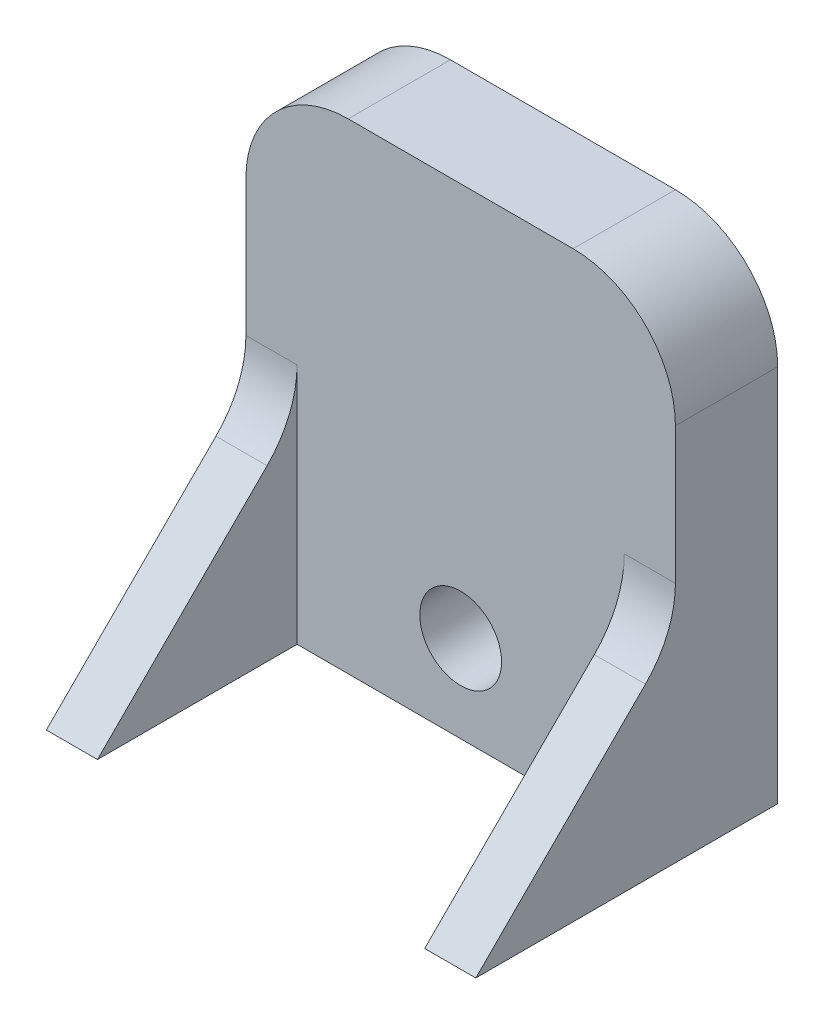
ISO-10303-21;
HEADER;
FILE_DESCRIPTION(('STEP AP214'),'2;1');
FILE_NAME('part.step','',(''),(''),'','','');
FILE_SCHEMA(('AUTOMOTIVE_DESIGN { 1 0 10303 214 1 1 1 1 }'));
ENDSEC;
DATA;
#1=APPLICATION_CONTEXT('core data for automotive mechanical design processes');
#2=APPLICATION_PROTOCOL_DEFINITION('international standard','automotive_design',2000,#1);
#3=PRODUCT_CONTEXT('',#1,'mechanical');
#4=PRODUCT('Part','Part','',(#3));
#5=PRODUCT_RELATED_PRODUCT_CATEGORY('part','',(#4));
#6=PRODUCT_DEFINITION_FORMATION('','',#4);
#7=PRODUCT_DEFINITION_CONTEXT('part definition',#1,'design');
#8=PRODUCT_DEFINITION('design','',#6,#7);
#9=PRODUCT_DEFINITION_SHAPE('','',#8);
#10=(LENGTH_UNIT() NAMED_UNIT(*) SI_UNIT(.MILLI.,.METRE.));
#11=(NAMED_UNIT(*) PLANE_ANGLE_UNIT() SI_UNIT($,.RADIAN.));
#12=(NAMED_UNIT(*) SI_UNIT($,.STERADIAN.) SOLID_ANGLE_UNIT());
#13=UNCERTAINTY_MEASURE_WITH_UNIT(LENGTH_MEASURE(1.E-05),#10,'distance_accuracy_value','');
#14=(GEOMETRIC_REPRESENTATION_CONTEXT(3) GLOBAL_UNCERTAINTY_ASSIGNED_CONTEXT((#13)) GLOBAL_UNIT_ASSIGNED_CONTEXT((#10,
#11,#12)) REPRESENTATION_CONTEXT('',''));
#15=CARTESIAN_POINT('',(0.,0.,0.));
#16=DIRECTION('',(0.,0.,1.));
#17=DIRECTION('',(1.,0.,0.));
#18=AXIS2_PLACEMENT_3D('',#15,#16,#17);
#19=CARTESIAN_POINT('',(-7.44489648097013,17.4806525942305,0.));
#20=DIRECTION('',(0.,0.,1.));
#21=DIRECTION('',(1.,0.,0.));
#22=AXIS2_PLACEMENT_3D('',#19,#20,#21);
#23=PLANE('',#22);
#24=CARTESIAN_POINT('',(-18.4448964809706,-11.0193474057693,0.));
#25=DIRECTION('',(0.,0.,1.));
#26=DIRECTION('',(1.,0.,0.));
#27=AXIS2_PLACEMENT_3D('',#24,#25,#26);
#28=CIRCLE('',#27,4.);
#29=CARTESIAN_POINT('',(-14.4448964809706,-11.0193474057693,0.));
#30=VERTEX_POINT('',#29);
#31=EDGE_CURVE('E159',#30,#30,#28,.T.);
#32=ORIENTED_EDGE('',*,*,#31,.F.);
#33=EDGE_LOOP('',(#32));
#34=FACE_BOUND('',#33,.T.);
#35=DIRECTION('',(0.,-1.,0.));
#36=VECTOR('',#35,1.);
#37=CARTESIAN_POINT('',(-2.44489648097043,0.,0.));
#38=LINE('',#37,#36);
#39=CARTESIAN_POINT('',(-2.44489648097036,4.14213562373103,0.));
#40=VERTEX_POINT('',#39);
#41=CARTESIAN_POINT('',(-2.44489648097061,-19.5193474057696,0.));
#42=VERTEX_POINT('',#41);
#43=EDGE_CURVE('E128',#40,#42,#38,.T.);
#44=ORIENTED_EDGE('',*,*,#43,.F.);
#45=DIRECTION('',(1.,0.,0.));
#46=VECTOR('',#45,1.);
#47=CARTESIAN_POINT('',(-7.44489648097036,4.14213562373112,0.));
#48=LINE('',#47,#46);
#49=CARTESIAN_POINT('',(2.55510351902964,4.14213562373095,0.));
#50=VERTEX_POINT('',#49);
#51=EDGE_CURVE('E220',#40,#50,#48,.T.);
#52=ORIENTED_EDGE('',*,*,#51,.T.);
#53=DIRECTION('',(0.,1.,0.));
#54=VECTOR('',#53,1.);
#55=CARTESIAN_POINT('',(2.55510351902923,-19.5193474057697,0.));
#56=LINE('',#55,#54);
#57=CARTESIAN_POINT('',(2.55510351902987,17.4806525942303,0.));
#58=VERTEX_POINT('',#57);
#59=EDGE_CURVE('E185',#50,#58,#56,.T.);
#60=ORIENTED_EDGE('',*,*,#59,.T.);
#61=CARTESIAN_POINT('',(-7.44489648097013,17.4806525942305,0.));
#62=DIRECTION('',(0.,0.,1.));
#63=DIRECTION('',(1.,0.,0.));
#64=AXIS2_PLACEMENT_3D('',#61,#62,#63);
#65=CIRCLE('',#64,10.);
#66=CARTESIAN_POINT('',(-7.44489648096995,27.4806525942305,0.));
#67=VERTEX_POINT('',#66);
#68=EDGE_CURVE('E187',#58,#67,#65,.T.);
#69=ORIENTED_EDGE('',*,*,#68,.T.);
#70=DIRECTION('',(-1.,0.,0.));
#71=VECTOR('',#70,1.);
#72=CARTESIAN_POINT('',(-7.44489648096995,27.4806525942305,0.));
#73=LINE('',#72,#71);
#74=CARTESIAN_POINT('',(-29.44489648097,27.4806525942309,0.));
#75=VERTEX_POINT('',#74);
#76=EDGE_CURVE('E190',#67,#75,#73,.T.);
#77=ORIENTED_EDGE('',*,*,#76,.T.);
#78=CARTESIAN_POINT('',(-29.4448964809701,17.4806525942309,0.));
#79=DIRECTION('',(0.,0.,1.));
#80=DIRECTION('',(-1.,0.,0.));
#81=AXIS2_PLACEMENT_3D('',#78,#79,#80);
#82=CIRCLE('',#81,10.);
#83=CARTESIAN_POINT('',(-39.4448964809701,17.480652594231,0.));
#84=VERTEX_POINT('',#83);
#85=EDGE_CURVE('E193',#75,#84,#82,.T.);
#86=ORIENTED_EDGE('',*,*,#85,.T.);
#87=DIRECTION('',(0.,-1.,0.));
#88=VECTOR('',#87,1.);
#89=CARTESIAN_POINT('',(-39.4448964809701,17.480652594231,0.));
#90=LINE('',#89,#88);
#91=CARTESIAN_POINT('',(-39.4448964809704,4.14213562373168,0.));
#92=VERTEX_POINT('',#91);
#93=EDGE_CURVE('E169',#84,#92,#90,.T.);
#94=ORIENTED_EDGE('',*,*,#93,.T.);
#95=DIRECTION('',(-1.,0.,0.));
#96=VECTOR('',#95,1.);
#97=CARTESIAN_POINT('',(-34.4448964809704,4.14213562373159,0.));
#98=LINE('',#97,#96);
#99=CARTESIAN_POINT('',(-34.4448964809704,4.14213562373159,0.));
#100=VERTEX_POINT('',#99);
#101=EDGE_CURVE('E213',#92,#100,#98,.F.);
#102=ORIENTED_EDGE('',*,*,#101,.T.);
#103=DIRECTION('',(0.,-1.,0.));
#104=VECTOR('',#103,1.);
#105=CARTESIAN_POINT('',(-34.4448964809704,6.00853317480465E-13,0.));
#106=LINE('',#105,#104);
#107=CARTESIAN_POINT('',(-34.4448964809706,-19.5193474057691,0.));
#108=VERTEX_POINT('',#107);
#109=EDGE_CURVE('E145',#100,#108,#106,.T.);
#110=ORIENTED_EDGE('',*,*,#109,.T.);
#111=DIRECTION('',(1.,0.,0.));
#112=VECTOR('',#111,1.);
#113=CARTESIAN_POINT('',(-39.4448964809708,-19.519347405769,0.));
#114=LINE('',#113,#112);
#115=EDGE_CURVE('E163',#108,#42,#114,.T.);
#116=ORIENTED_EDGE('',*,*,#115,.T.);
#117=EDGE_LOOP('',(#44,#52,#60,#69,#77,#86,#94,#102,#110,#116));
#118=FACE_BOUND('',#117,.T.);
#119=ADVANCED_FACE('F33',(#34,#118),#23,.T.);
#120=CARTESIAN_POINT('',(-39.4448964809708,-19.519347405769,-10.));
#121=DIRECTION('',(0.,-1.,0.));
#122=DIRECTION('',(1.,0.,0.));
#123=AXIS2_PLACEMENT_3D('',#120,#121,#122);
#124=PLANE('',#123);
#125=ORIENTED_EDGE('',*,*,#115,.F.);
#126=DIRECTION('',(0.,0.,1.));
#127=VECTOR('',#126,1.);
#128=CARTESIAN_POINT('',(-34.4448964809708,-19.5193474057691,0.));
#129=LINE('',#128,#127);
#130=CARTESIAN_POINT('',(-34.4448964809708,-19.5193474057691,19.5193474057699));
#131=VERTEX_POINT('',#130);
#132=EDGE_CURVE('E148',#108,#131,#129,.T.);
#133=ORIENTED_EDGE('',*,*,#132,.T.);
#134=DIRECTION('',(-1.,0.,0.));
#135=VECTOR('',#134,1.);
#136=CARTESIAN_POINT('',(-34.4448964809708,-19.5193474057691,19.5193474057699));
#137=LINE('',#136,#135);
#138=CARTESIAN_POINT('',(-39.4448964809708,-19.519347405769,19.5193474057699));
#139=VERTEX_POINT('',#138);
#140=EDGE_CURVE('E154',#131,#139,#137,.T.);
#141=ORIENTED_EDGE('',*,*,#140,.T.);
#142=DIRECTION('',(0.,0.,1.));
#143=VECTOR('',#142,1.);
#144=CARTESIAN_POINT('',(-39.4448964809708,-19.519347405769,-10.));
#145=LINE('',#144,#143);
#146=CARTESIAN_POINT('',(-39.4448964809708,-19.519347405769,-10.));
#147=VERTEX_POINT('',#146);
#148=EDGE_CURVE('E198',#147,#139,#145,.T.);
#149=ORIENTED_EDGE('',*,*,#148,.F.);
#150=DIRECTION('',(1.,0.,0.));
#151=VECTOR('',#150,1.);
#152=CARTESIAN_POINT('',(-39.4448964809708,-19.519347405769,-10.));
#153=LINE('',#152,#151);
#154=CARTESIAN_POINT('',(2.55510351902923,-19.5193474057697,-10.));
#155=VERTEX_POINT('',#154);
#156=EDGE_CURVE('E166',#147,#155,#153,.T.);
#157=ORIENTED_EDGE('',*,*,#156,.T.);
#158=DIRECTION('',(0.,0.,1.));
#159=VECTOR('',#158,1.);
#160=CARTESIAN_POINT('',(2.55510351902923,-19.5193474057697,-10.));
#161=LINE('',#160,#159);
#162=CARTESIAN_POINT('',(2.55510351902923,-19.5193474057697,19.5193474057699));
#163=VERTEX_POINT('',#162);
#164=EDGE_CURVE('E136',#155,#163,#161,.T.);
#165=ORIENTED_EDGE('',*,*,#164,.T.);
#166=DIRECTION('',(1.,0.,0.));
#167=VECTOR('',#166,1.);
#168=CARTESIAN_POINT('',(-2.44489648097077,-19.5193474057696,19.5193474057699));
#169=LINE('',#168,#167);
#170=CARTESIAN_POINT('',(-2.44489648097077,-19.5193474057696,19.5193474057699));
#171=VERTEX_POINT('',#170);
#172=EDGE_CURVE('E131',#171,#163,#169,.T.);
#173=ORIENTED_EDGE('',*,*,#172,.F.);
#174=DIRECTION('',(0.,0.,1.));
#175=VECTOR('',#174,1.);
#176=CARTESIAN_POINT('',(-2.44489648097077,-19.5193474057696,0.));
#177=LINE('',#176,#175);
#178=EDGE_CURVE('E123',#42,#171,#177,.T.);
#179=ORIENTED_EDGE('',*,*,#178,.F.);
#180=EDGE_LOOP('',(#125,#133,#141,#149,#157,#165,#173,#179));
#181=FACE_BOUND('',#180,.T.);
#182=ADVANCED_FACE('F134',(#181),#124,.T.);
#183=CARTESIAN_POINT('',(-39.4448964809701,17.480652594231,-10.));
#184=DIRECTION('',(-1.,0.,0.));
#185=DIRECTION('',(0.,-1.,0.));
#186=AXIS2_PLACEMENT_3D('',#183,#184,#185);
#187=PLANE('',#186);
#188=ORIENTED_EDGE('',*,*,#93,.F.);
#189=DIRECTION('',(0.,0.,1.));
#190=VECTOR('',#189,1.);
#191=CARTESIAN_POINT('',(-39.4448964809701,17.480652594231,-10.));
#192=LINE('',#191,#190);
#193=CARTESIAN_POINT('',(-39.4448964809701,17.480652594231,-10.));
#194=VERTEX_POINT('',#193);
#195=EDGE_CURVE('E201',#194,#84,#192,.T.);
#196=ORIENTED_EDGE('',*,*,#195,.F.);
#197=DIRECTION('',(0.,-1.,0.));
#198=VECTOR('',#197,1.);
#199=CARTESIAN_POINT('',(-39.4448964809701,17.480652594231,-10.));
#200=LINE('',#199,#198);
#201=EDGE_CURVE('E181',#194,#147,#200,.T.);
#202=ORIENTED_EDGE('',*,*,#201,.T.);
#203=ORIENTED_EDGE('',*,*,#148,.T.);
#204=DIRECTION('',(0.,0.707106781186544,-0.707106781186552));
#205=VECTOR('',#204,1.);
#206=CARTESIAN_POINT('',(-39.4448964809708,-19.519347405769,19.5193474057699));
#207=LINE('',#206,#205);
#208=CARTESIAN_POINT('',(-39.4448964809705,-2.92893218813384,2.92893218813456));
#209=VERTEX_POINT('',#208);
#210=EDGE_CURVE('E137',#139,#209,#207,.T.);
#211=ORIENTED_EDGE('',*,*,#210,.T.);
#212=CARTESIAN_POINT('',(-39.4448964809704,4.14213562373168,10.));
#213=DIRECTION('',(-1.,0.,0.));
#214=DIRECTION('',(0.,-1.,0.));
#215=AXIS2_PLACEMENT_3D('',#212,#213,#214);
#216=CIRCLE('',#215,10.);
#217=EDGE_CURVE('E216',#209,#92,#216,.F.);
#218=ORIENTED_EDGE('',*,*,#217,.T.);
#219=EDGE_LOOP('',(#188,#196,#202,#203,#211,#218));
#220=FACE_BOUND('',#219,.T.);
#221=ADVANCED_FACE('F243',(#220),#187,.T.);
#222=CARTESIAN_POINT('',(-29.4448964809701,17.4806525942309,-10.));
#223=DIRECTION('',(0.,0.,1.));
#224=DIRECTION('',(1.,0.,0.));
#225=AXIS2_PLACEMENT_3D('',#222,#223,#224);
#226=CYLINDRICAL_SURFACE('',#225,10.);
#227=ORIENTED_EDGE('',*,*,#85,.F.);
#228=DIRECTION('',(0.,0.,1.));
#229=VECTOR('',#228,1.);
#230=CARTESIAN_POINT('',(-29.44489648097,27.4806525942309,-10.));
#231=LINE('',#230,#229);
#232=CARTESIAN_POINT('',(-29.44489648097,27.4806525942309,-10.));
#233=VERTEX_POINT('',#232);
#234=EDGE_CURVE('E203',#233,#75,#231,.T.);
#235=ORIENTED_EDGE('',*,*,#234,.F.);
#236=CARTESIAN_POINT('',(-29.4448964809701,17.4806525942309,-10.));
#237=DIRECTION('',(0.,0.,1.));
#238=DIRECTION('',(-1.,0.,0.));
#239=AXIS2_PLACEMENT_3D('',#236,#237,#238);
#240=CIRCLE('',#239,10.);
#241=EDGE_CURVE('E178',#233,#194,#240,.T.);
#242=ORIENTED_EDGE('',*,*,#241,.T.);
#243=ORIENTED_EDGE('',*,*,#195,.T.);
#244=EDGE_LOOP('',(#227,#235,#242,#243));
#245=FACE_BOUND('',#244,.T.);
#246=ADVANCED_FACE('F240',(#245),#226,.T.);
#247=CARTESIAN_POINT('',(-7.44489648096995,27.4806525942305,-10.));
#248=DIRECTION('',(0.,1.,0.));
#249=DIRECTION('',(-1.,0.,0.));
#250=AXIS2_PLACEMENT_3D('',#247,#248,#249);
#251=PLANE('',#250);
#252=ORIENTED_EDGE('',*,*,#76,.F.);
#253=DIRECTION('',(0.,0.,1.));
#254=VECTOR('',#253,1.);
#255=CARTESIAN_POINT('',(-7.44489648096995,27.4806525942305,-10.));
#256=LINE('',#255,#254);
#257=CARTESIAN_POINT('',(-7.44489648096995,27.4806525942305,-10.));
#258=VERTEX_POINT('',#257);
#259=EDGE_CURVE('E205',#258,#67,#256,.T.);
#260=ORIENTED_EDGE('',*,*,#259,.F.);
#261=DIRECTION('',(-1.,0.,0.));
#262=VECTOR('',#261,1.);
#263=CARTESIAN_POINT('',(-7.44489648096995,27.4806525942305,-10.));
#264=LINE('',#263,#262);
#265=EDGE_CURVE('E175',#258,#233,#264,.T.);
#266=ORIENTED_EDGE('',*,*,#265,.T.);
#267=ORIENTED_EDGE('',*,*,#234,.T.);
#268=EDGE_LOOP('',(#252,#260,#266,#267));
#269=FACE_BOUND('',#268,.T.);
#270=ADVANCED_FACE('F236',(#269),#251,.T.);
#271=CARTESIAN_POINT('',(-7.44489648097013,17.4806525942305,-10.));
#272=DIRECTION('',(0.,0.,1.));
#273=DIRECTION('',(1.,0.,0.));
#274=AXIS2_PLACEMENT_3D('',#271,#272,#273);
#275=CYLINDRICAL_SURFACE('',#274,10.);
#276=ORIENTED_EDGE('',*,*,#68,.F.);
#277=DIRECTION('',(0.,0.,1.));
#278=VECTOR('',#277,1.);
#279=CARTESIAN_POINT('',(2.55510351902987,17.4806525942303,-10.));
#280=LINE('',#279,#278);
#281=CARTESIAN_POINT('',(2.55510351902987,17.4806525942303,-10.));
#282=VERTEX_POINT('',#281);
#283=EDGE_CURVE('E207',#282,#58,#280,.T.);
#284=ORIENTED_EDGE('',*,*,#283,.F.);
#285=CARTESIAN_POINT('',(-7.44489648097013,17.4806525942305,-10.));
#286=DIRECTION('',(0.,0.,1.));
#287=DIRECTION('',(1.,0.,0.));
#288=AXIS2_PLACEMENT_3D('',#285,#286,#287);
#289=CIRCLE('',#288,10.);
#290=EDGE_CURVE('E172',#282,#258,#289,.T.);
#291=ORIENTED_EDGE('',*,*,#290,.T.);
#292=ORIENTED_EDGE('',*,*,#259,.T.);
#293=EDGE_LOOP('',(#276,#284,#291,#292));
#294=FACE_BOUND('',#293,.T.);
#295=ADVANCED_FACE('F231',(#294),#275,.T.);
#296=CARTESIAN_POINT('',(2.55510351902923,-19.5193474057697,-10.));
#297=DIRECTION('',(1.,0.,0.));
#298=DIRECTION('',(0.,1.,0.));
#299=AXIS2_PLACEMENT_3D('',#296,#297,#298);
#300=PLANE('',#299);
#301=ORIENTED_EDGE('',*,*,#59,.F.);
#302=CARTESIAN_POINT('',(2.55510351902964,4.14213562373095,10.));
#303=DIRECTION('',(1.,0.,0.));
#304=DIRECTION('',(0.,1.,0.));
#305=AXIS2_PLACEMENT_3D('',#302,#303,#304);
#306=CIRCLE('',#305,10.);
#307=CARTESIAN_POINT('',(2.55510351902952,-2.92893218813457,2.92893218813456));
#308=VERTEX_POINT('',#307);
#309=EDGE_CURVE('E41',#50,#308,#306,.F.);
#310=ORIENTED_EDGE('',*,*,#309,.T.);
#311=DIRECTION('',(0.,0.707106781186544,-0.707106781186552));
#312=VECTOR('',#311,1.);
#313=CARTESIAN_POINT('',(2.55510351902923,-19.5193474057697,19.5193474057699));
#314=LINE('',#313,#312);
#315=EDGE_CURVE('E141',#163,#308,#314,.T.);
#316=ORIENTED_EDGE('',*,*,#315,.F.);
#317=ORIENTED_EDGE('',*,*,#164,.F.);
#318=DIRECTION('',(0.,1.,0.));
#319=VECTOR('',#318,1.);
#320=CARTESIAN_POINT('',(2.55510351902923,-19.5193474057697,-10.));
#321=LINE('',#320,#319);
#322=EDGE_CURVE('E168',#155,#282,#321,.T.);
#323=ORIENTED_EDGE('',*,*,#322,.T.);
#324=ORIENTED_EDGE('',*,*,#283,.T.);
#325=EDGE_LOOP('',(#301,#310,#316,#317,#323,#324));
#326=FACE_BOUND('',#325,.T.);
#327=ADVANCED_FACE('F226',(#326),#300,.T.);
#328=CARTESIAN_POINT('',(-7.44489648097013,17.4806525942305,-10.));
#329=DIRECTION('',(0.,0.,1.));
#330=DIRECTION('',(1.,0.,0.));
#331=AXIS2_PLACEMENT_3D('',#328,#329,#330);
#332=PLANE('',#331);
#333=CARTESIAN_POINT('',(-18.4448964809706,-11.0193474057693,-10.));
#334=DIRECTION('',(0.,0.,1.));
#335=DIRECTION('',(1.,0.,0.));
#336=AXIS2_PLACEMENT_3D('',#333,#334,#335);
#337=CIRCLE('',#336,4.);
#338=CARTESIAN_POINT('',(-14.4448964809706,-11.0193474057693,-10.));
#339=VERTEX_POINT('',#338);
#340=EDGE_CURVE('E160',#339,#339,#337,.T.);
#341=ORIENTED_EDGE('',*,*,#340,.T.);
#342=EDGE_LOOP('',(#341));
#343=FACE_BOUND('',#342,.T.);
#344=ORIENTED_EDGE('',*,*,#156,.F.);
#345=ORIENTED_EDGE('',*,*,#201,.F.);
#346=ORIENTED_EDGE('',*,*,#241,.F.);
#347=ORIENTED_EDGE('',*,*,#265,.F.);
#348=ORIENTED_EDGE('',*,*,#290,.F.);
#349=ORIENTED_EDGE('',*,*,#322,.F.);
#350=EDGE_LOOP('',(#344,#345,#346,#347,#348,#349));
#351=FACE_BOUND('',#350,.T.);
#352=ADVANCED_FACE('F257',(#343,#351),#332,.F.);
#353=CARTESIAN_POINT('',(-18.4448964809706,-11.0193474057693,-10.));
#354=DIRECTION('',(0.,0.,1.));
#355=DIRECTION('',(1.,0.,0.));
#356=AXIS2_PLACEMENT_3D('',#353,#354,#355);
#357=CYLINDRICAL_SURFACE('',#356,4.);
#358=ORIENTED_EDGE('',*,*,#340,.F.);
#359=EDGE_LOOP('',(#358));
#360=FACE_BOUND('',#359,.T.);
#361=ORIENTED_EDGE('',*,*,#31,.T.);
#362=EDGE_LOOP('',(#361));
#363=FACE_BOUND('',#362,.T.);
#364=ADVANCED_FACE('F259',(#360,#363),#357,.F.);
#365=CARTESIAN_POINT('',(-34.4448964809708,-19.5193474057691,19.5193474057699));
#366=DIRECTION('',(0.,0.707106781186552,0.707106781186544));
#367=DIRECTION('',(0.,-0.707106781186544,0.707106781186551));
#368=AXIS2_PLACEMENT_3D('',#365,#366,#367);
#369=PLANE('',#368);
#370=DIRECTION('',(0.,0.707106781186544,-0.707106781186552));
#371=VECTOR('',#370,1.);
#372=CARTESIAN_POINT('',(-34.4448964809708,-19.5193474057691,19.5193474057699));
#373=LINE('',#372,#371);
#374=CARTESIAN_POINT('',(-34.4448964809705,-2.92893218813392,2.92893218813456));
#375=VERTEX_POINT('',#374);
#376=EDGE_CURVE('E151',#131,#375,#373,.T.);
#377=ORIENTED_EDGE('',*,*,#376,.T.);
#378=DIRECTION('',(-1.,0.,0.));
#379=VECTOR('',#378,1.);
#380=CARTESIAN_POINT('',(-39.4448964809705,-2.92893218813384,2.92893218813456));
#381=LINE('',#380,#379);
#382=EDGE_CURVE('E200',#375,#209,#381,.T.);
#383=ORIENTED_EDGE('',*,*,#382,.T.);
#384=ORIENTED_EDGE('',*,*,#210,.F.);
#385=ORIENTED_EDGE('',*,*,#140,.F.);
#386=EDGE_LOOP('',(#377,#383,#384,#385));
#387=FACE_BOUND('',#386,.T.);
#388=ADVANCED_FACE('F253',(#387),#369,.T.);
#389=CARTESIAN_POINT('',(-34.4448964809704,5.99981929952822E-13,0.));
#390=DIRECTION('',(-1.,0.,0.));
#391=DIRECTION('',(0.,-1.,0.));
#392=AXIS2_PLACEMENT_3D('',#389,#390,#391);
#393=PLANE('',#392);
#394=ORIENTED_EDGE('',*,*,#109,.F.);
#395=CARTESIAN_POINT('',(-34.4448964809704,4.14213562373159,10.));
#396=DIRECTION('',(-1.,0.,0.));
#397=DIRECTION('',(0.,-1.,0.));
#398=AXIS2_PLACEMENT_3D('',#395,#396,#397);
#399=CIRCLE('',#398,10.);
#400=EDGE_CURVE('E218',#100,#375,#399,.T.);
#401=ORIENTED_EDGE('',*,*,#400,.T.);
#402=ORIENTED_EDGE('',*,*,#376,.F.);
#403=ORIENTED_EDGE('',*,*,#132,.F.);
#404=EDGE_LOOP('',(#394,#401,#402,#403));
#405=FACE_BOUND('',#404,.T.);
#406=ADVANCED_FACE('F251',(#405),#393,.F.);
#407=CARTESIAN_POINT('',(-34.4448964809704,4.14213562373159,10.));
#408=DIRECTION('',(1.,0.,0.));
#409=DIRECTION('',(0.,1.,0.));
#410=AXIS2_PLACEMENT_3D('',#407,#408,#409);
#411=CYLINDRICAL_SURFACE('',#410,10.);
#412=ORIENTED_EDGE('',*,*,#400,.F.);
#413=ORIENTED_EDGE('',*,*,#101,.F.);
#414=ORIENTED_EDGE('',*,*,#217,.F.);
#415=ORIENTED_EDGE('',*,*,#382,.F.);
#416=EDGE_LOOP('',(#412,#413,#414,#415));
#417=FACE_BOUND('',#416,.T.);
#418=ADVANCED_FACE('F247',(#417),#411,.F.);
#419=CARTESIAN_POINT('',(-2.44489648097077,-19.5193474057696,19.5193474057699));
#420=DIRECTION('',(0.,-0.707106781186552,-0.707106781186544));
#421=DIRECTION('',(0.,0.707106781186544,-0.707106781186551));
#422=AXIS2_PLACEMENT_3D('',#419,#420,#421);
#423=PLANE('',#422);
#424=ORIENTED_EDGE('',*,*,#315,.T.);
#425=DIRECTION('',(1.,0.,0.));
#426=VECTOR('',#425,1.);
#427=CARTESIAN_POINT('',(-2.44489648097048,-2.92893218813449,2.92893218813457));
#428=LINE('',#427,#426);
#429=CARTESIAN_POINT('',(-2.44489648097048,-2.92893218813448,2.92893218813456));
#430=VERTEX_POINT('',#429);
#431=EDGE_CURVE('E48',#308,#430,#428,.F.);
#432=ORIENTED_EDGE('',*,*,#431,.T.);
#433=DIRECTION('',(0.,0.707106781186544,-0.707106781186552));
#434=VECTOR('',#433,1.);
#435=CARTESIAN_POINT('',(-2.44489648097077,-19.5193474057696,19.5193474057699));
#436=LINE('',#435,#434);
#437=EDGE_CURVE('E126',#171,#430,#436,.T.);
#438=ORIENTED_EDGE('',*,*,#437,.F.);
#439=ORIENTED_EDGE('',*,*,#172,.T.);
#440=EDGE_LOOP('',(#424,#432,#438,#439));
#441=FACE_BOUND('',#440,.T.);
#442=ADVANCED_FACE('F139',(#441),#423,.F.);
#443=CARTESIAN_POINT('',(-2.44489648097043,0.,0.));
#444=DIRECTION('',(1.,0.,0.));
#445=DIRECTION('',(0.,-1.,0.));
#446=AXIS2_PLACEMENT_3D('',#443,#444,#445);
#447=PLANE('',#446);
#448=ORIENTED_EDGE('',*,*,#43,.T.);
#449=ORIENTED_EDGE('',*,*,#178,.T.);
#450=ORIENTED_EDGE('',*,*,#437,.T.);
#451=CARTESIAN_POINT('',(-2.44489648097036,4.14213562373103,10.));
#452=DIRECTION('',(1.,0.,0.));
#453=DIRECTION('',(0.,1.,0.));
#454=AXIS2_PLACEMENT_3D('',#451,#452,#453);
#455=CIRCLE('',#454,10.);
#456=EDGE_CURVE('E11',#430,#40,#455,.T.);
#457=ORIENTED_EDGE('',*,*,#456,.T.);
#458=EDGE_LOOP('',(#448,#449,#450,#457));
#459=FACE_BOUND('',#458,.T.);
#460=ADVANCED_FACE('F125',(#459),#447,.F.);
#461=CARTESIAN_POINT('',(-7.44489648097036,4.14213562373112,10.));
#462=DIRECTION('',(1.,0.,0.));
#463=DIRECTION('',(0.,1.,0.));
#464=AXIS2_PLACEMENT_3D('',#461,#462,#463);
#465=CYLINDRICAL_SURFACE('',#464,10.);
#466=ORIENTED_EDGE('',*,*,#456,.F.);
#467=ORIENTED_EDGE('',*,*,#431,.F.);
#468=ORIENTED_EDGE('',*,*,#309,.F.);
#469=ORIENTED_EDGE('',*,*,#51,.F.);
#470=EDGE_LOOP('',(#466,#467,#468,#469));
#471=FACE_BOUND('',#470,.T.);
#472=ADVANCED_FACE('F35',(#471),#465,.F.);
#473=CLOSED_SHELL('',(#119,#182,#221,#246,#270,#295,#327,#352,#364,#388,#406,#418,#442,#460,#472));
#474=MANIFOLD_SOLID_BREP('B2',#473);
#475=ADVANCED_BREP_SHAPE_REPRESENTATION('',(#18,#474),#14);
#476=SHAPE_DEFINITION_REPRESENTATION(#9,#475);
ENDSEC;
END-ISO-10303-21;
